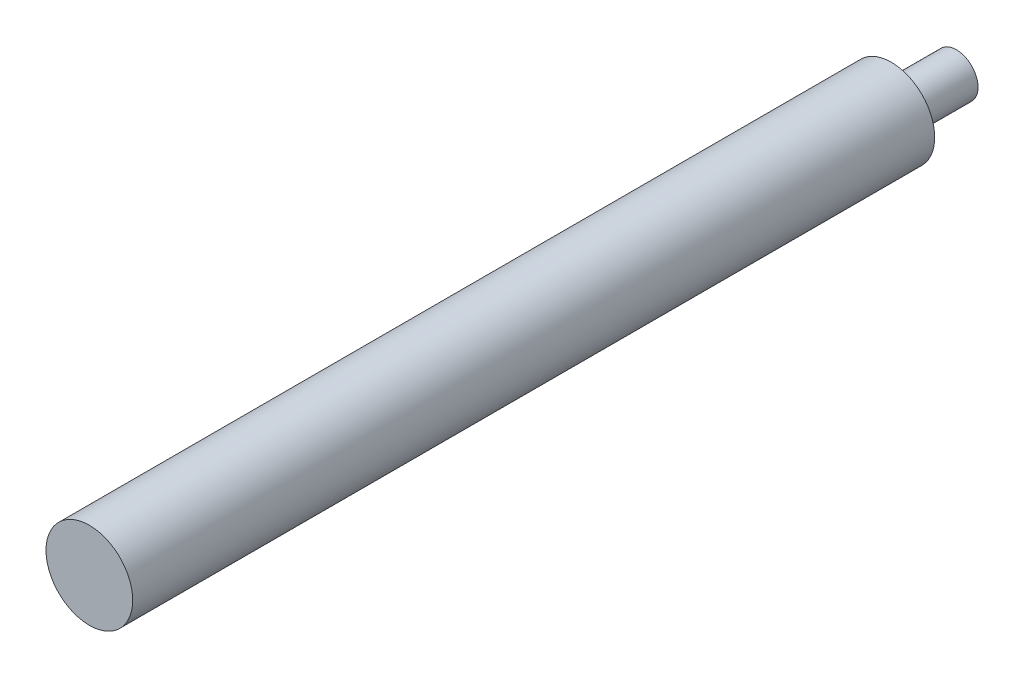
ISO-10303-21;
HEADER;
FILE_DESCRIPTION(('STEP AP214'),'2;1');
FILE_NAME('part.step','',(''),(''),'','','');
FILE_SCHEMA(('AUTOMOTIVE_DESIGN { 1 0 10303 214 1 1 1 1 }'));
ENDSEC;
DATA;
#1=APPLICATION_CONTEXT('core data for automotive mechanical design processes');
#2=APPLICATION_PROTOCOL_DEFINITION('international standard','automotive_design',2000,#1);
#3=PRODUCT_CONTEXT('',#1,'mechanical');
#4=PRODUCT('Part','Part','',(#3));
#5=PRODUCT_RELATED_PRODUCT_CATEGORY('part','',(#4));
#6=PRODUCT_DEFINITION_FORMATION('','',#4);
#7=PRODUCT_DEFINITION_CONTEXT('part definition',#1,'design');
#8=PRODUCT_DEFINITION('design','',#6,#7);
#9=PRODUCT_DEFINITION_SHAPE('','',#8);
#10=(LENGTH_UNIT() NAMED_UNIT(*) SI_UNIT(.MILLI.,.METRE.));
#11=(NAMED_UNIT(*) PLANE_ANGLE_UNIT() SI_UNIT($,.RADIAN.));
#12=(NAMED_UNIT(*) SI_UNIT($,.STERADIAN.) SOLID_ANGLE_UNIT());
#13=UNCERTAINTY_MEASURE_WITH_UNIT(LENGTH_MEASURE(1.E-05),#10,'distance_accuracy_value','');
#14=(GEOMETRIC_REPRESENTATION_CONTEXT(3) GLOBAL_UNCERTAINTY_ASSIGNED_CONTEXT((#13)) GLOBAL_UNIT_ASSIGNED_CONTEXT((#10,
#11,#12)) REPRESENTATION_CONTEXT('',''));
#15=CARTESIAN_POINT('',(0.,0.,0.));
#16=DIRECTION('',(0.,0.,1.));
#17=DIRECTION('',(1.,0.,0.));
#18=AXIS2_PLACEMENT_3D('',#15,#16,#17);
#19=CARTESIAN_POINT('',(0.,0.,200.));
#20=DIRECTION('',(0.,0.,-1.));
#21=DIRECTION('',(-1.,0.,0.));
#22=AXIS2_PLACEMENT_3D('',#19,#20,#21);
#23=CYLINDRICAL_SURFACE('',#22,10.);
#24=CARTESIAN_POINT('',(0.,0.,200.));
#25=DIRECTION('',(0.,0.,1.));
#26=DIRECTION('',(1.,0.,0.));
#27=AXIS2_PLACEMENT_3D('',#24,#25,#26);
#28=CIRCLE('',#27,10.);
#29=CARTESIAN_POINT('',(10.,0.,200.));
#30=VERTEX_POINT('',#29);
#31=EDGE_CURVE('E10',#30,#30,#28,.T.);
#32=ORIENTED_EDGE('',*,*,#31,.F.);
#33=EDGE_LOOP('',(#32));
#34=FACE_BOUND('',#33,.T.);
#35=CARTESIAN_POINT('',(0.,0.,15.));
#36=DIRECTION('',(0.,0.,-1.));
#37=DIRECTION('',(-1.,0.,0.));
#38=AXIS2_PLACEMENT_3D('',#35,#36,#37);
#39=CIRCLE('',#38,10.);
#40=CARTESIAN_POINT('',(-10.,0.,15.));
#41=VERTEX_POINT('',#40);
#42=EDGE_CURVE('E37',#41,#41,#39,.T.);
#43=ORIENTED_EDGE('',*,*,#42,.F.);
#44=EDGE_LOOP('',(#43));
#45=FACE_BOUND('',#44,.T.);
#46=ADVANCED_FACE('F40',(#34,#45),#23,.T.);
#47=CARTESIAN_POINT('',(0.,0.,200.));
#48=DIRECTION('',(0.,0.,1.));
#49=DIRECTION('',(1.,0.,0.));
#50=AXIS2_PLACEMENT_3D('',#47,#48,#49);
#51=PLANE('',#50);
#52=ORIENTED_EDGE('',*,*,#31,.T.);
#53=EDGE_LOOP('',(#52));
#54=FACE_BOUND('',#53,.T.);
#55=ADVANCED_FACE('F61',(#54),#51,.T.);
#56=CARTESIAN_POINT('',(0.,0.,15.));
#57=DIRECTION('',(0.,0.,-1.));
#58=DIRECTION('',(-1.,0.,0.));
#59=AXIS2_PLACEMENT_3D('',#56,#57,#58);
#60=PLANE('',#59);
#61=CARTESIAN_POINT('',(0.,0.,15.));
#62=DIRECTION('',(0.,0.,-1.));
#63=DIRECTION('',(-1.,0.,0.));
#64=AXIS2_PLACEMENT_3D('',#61,#62,#63);
#65=CIRCLE('',#64,5.);
#66=CARTESIAN_POINT('',(-5.,0.,15.));
#67=VERTEX_POINT('',#66);
#68=EDGE_CURVE('E50',#67,#67,#65,.T.);
#69=ORIENTED_EDGE('',*,*,#68,.F.);
#70=EDGE_LOOP('',(#69));
#71=FACE_BOUND('',#70,.T.);
#72=ORIENTED_EDGE('',*,*,#42,.T.);
#73=EDGE_LOOP('',(#72));
#74=FACE_BOUND('',#73,.T.);
#75=ADVANCED_FACE('F59',(#71,#74),#60,.T.);
#76=CARTESIAN_POINT('',(0.,0.,15.));
#77=DIRECTION('',(0.,0.,-1.));
#78=DIRECTION('',(-1.,0.,0.));
#79=AXIS2_PLACEMENT_3D('',#76,#77,#78);
#80=CYLINDRICAL_SURFACE('',#79,5.);
#81=ORIENTED_EDGE('',*,*,#68,.T.);
#82=EDGE_LOOP('',(#81));
#83=FACE_BOUND('',#82,.T.);
#84=CARTESIAN_POINT('',(0.,0.,0.));
#85=DIRECTION('',(0.,0.,-1.));
#86=DIRECTION('',(-1.,0.,0.));
#87=AXIS2_PLACEMENT_3D('',#84,#85,#86);
#88=CIRCLE('',#87,5.);
#89=CARTESIAN_POINT('',(-5.,0.,0.));
#90=VERTEX_POINT('',#89);
#91=EDGE_CURVE('E47',#90,#90,#88,.T.);
#92=ORIENTED_EDGE('',*,*,#91,.F.);
#93=EDGE_LOOP('',(#92));
#94=FACE_BOUND('',#93,.T.);
#95=ADVANCED_FACE('F54',(#83,#94),#80,.T.);
#96=CARTESIAN_POINT('',(0.,0.,0.));
#97=DIRECTION('',(0.,0.,1.));
#98=DIRECTION('',(1.,0.,0.));
#99=AXIS2_PLACEMENT_3D('',#96,#97,#98);
#100=PLANE('',#99);
#101=ORIENTED_EDGE('',*,*,#91,.T.);
#102=EDGE_LOOP('',(#101));
#103=FACE_BOUND('',#102,.T.);
#104=ADVANCED_FACE('F74',(#103),#100,.F.);
#105=CLOSED_SHELL('',(#46,#55,#75,#95,#104));
#106=MANIFOLD_SOLID_BREP('B2',#105);
#107=ADVANCED_BREP_SHAPE_REPRESENTATION('',(#18,#106),#14);
#108=SHAPE_DEFINITION_REPRESENTATION(#9,#107);
ENDSEC;
END-ISO-10303-21;
